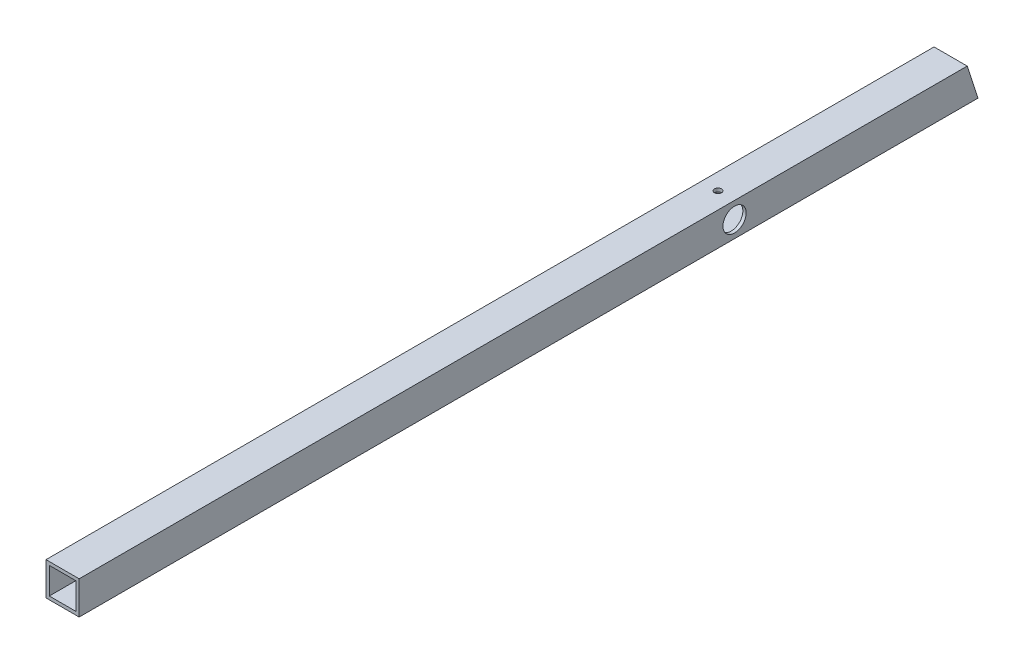
ISO-10303-21;
HEADER;
FILE_DESCRIPTION(('STEP AP214'),'2;1');
FILE_NAME('part.step','',(''),(''),'','','');
FILE_SCHEMA(('AUTOMOTIVE_DESIGN { 1 0 10303 214 1 1 1 1 }'));
ENDSEC;
DATA;
#1=APPLICATION_CONTEXT('core data for automotive mechanical design processes');
#2=APPLICATION_PROTOCOL_DEFINITION('international standard','automotive_design',2000,#1);
#3=PRODUCT_CONTEXT('',#1,'mechanical');
#4=PRODUCT('Part','Part','',(#3));
#5=PRODUCT_RELATED_PRODUCT_CATEGORY('part','',(#4));
#6=PRODUCT_DEFINITION_FORMATION('','',#4);
#7=PRODUCT_DEFINITION_CONTEXT('part definition',#1,'design');
#8=PRODUCT_DEFINITION('design','',#6,#7);
#9=PRODUCT_DEFINITION_SHAPE('','',#8);
#10=(LENGTH_UNIT() NAMED_UNIT(*) SI_UNIT(.MILLI.,.METRE.));
#11=(NAMED_UNIT(*) PLANE_ANGLE_UNIT() SI_UNIT($,.RADIAN.));
#12=(NAMED_UNIT(*) SI_UNIT($,.STERADIAN.) SOLID_ANGLE_UNIT());
#13=UNCERTAINTY_MEASURE_WITH_UNIT(LENGTH_MEASURE(1.E-05),#10,'distance_accuracy_value','');
#14=(GEOMETRIC_REPRESENTATION_CONTEXT(3) GLOBAL_UNCERTAINTY_ASSIGNED_CONTEXT((#13)) GLOBAL_UNIT_ASSIGNED_CONTEXT((#10,
#11,#12)) REPRESENTATION_CONTEXT('',''));
#15=CARTESIAN_POINT('',(0.,0.,0.));
#16=DIRECTION('',(0.,0.,1.));
#17=DIRECTION('',(1.,0.,0.));
#18=AXIS2_PLACEMENT_3D('',#15,#16,#17);
#19=CARTESIAN_POINT('',(15.875,31.75,233.045));
#20=DIRECTION('',(0.,1.,0.));
#21=DIRECTION('',(0.,0.,1.));
#22=AXIS2_PLACEMENT_3D('',#19,#20,#21);
#23=CYLINDRICAL_SURFACE('',#22,3.3655);
#24=CARTESIAN_POINT('',(15.875,28.575,233.045));
#25=DIRECTION('',(0.,1.,0.));
#26=DIRECTION('',(0.,0.,1.));
#27=AXIS2_PLACEMENT_3D('',#24,#25,#26);
#28=CIRCLE('',#27,3.3655);
#29=CARTESIAN_POINT('',(15.875,28.575,236.4105));
#30=VERTEX_POINT('',#29);
#31=EDGE_CURVE('E88',#30,#30,#28,.F.);
#32=ORIENTED_EDGE('',*,*,#31,.T.);
#33=EDGE_LOOP('',(#32));
#34=FACE_BOUND('',#33,.T.);
#35=CARTESIAN_POINT('',(15.875,31.75,233.045));
#36=DIRECTION('',(0.,1.,0.));
#37=DIRECTION('',(0.,0.,1.));
#38=AXIS2_PLACEMENT_3D('',#35,#36,#37);
#39=CIRCLE('',#38,3.3655);
#40=CARTESIAN_POINT('',(15.875,31.75,236.4105));
#41=VERTEX_POINT('',#40);
#42=EDGE_CURVE('E20',#41,#41,#39,.F.);
#43=ORIENTED_EDGE('',*,*,#42,.F.);
#44=EDGE_LOOP('',(#43));
#45=FACE_BOUND('',#44,.T.);
#46=ADVANCED_FACE('F17',(#34,#45),#23,.F.);
#47=CARTESIAN_POINT('',(31.75,15.875,233.045));
#48=DIRECTION('',(1.,0.,0.));
#49=DIRECTION('',(0.,0.,-1.));
#50=AXIS2_PLACEMENT_3D('',#47,#48,#49);
#51=CYLINDRICAL_SURFACE('',#50,11.1125);
#52=CARTESIAN_POINT('',(28.575,15.875,233.045));
#53=DIRECTION('',(1.,0.,0.));
#54=DIRECTION('',(0.,0.,-1.));
#55=AXIS2_PLACEMENT_3D('',#52,#53,#54);
#56=CIRCLE('',#55,11.1125);
#57=CARTESIAN_POINT('',(28.575,15.875,221.9325));
#58=VERTEX_POINT('',#57);
#59=EDGE_CURVE('E122',#58,#58,#56,.F.);
#60=ORIENTED_EDGE('',*,*,#59,.T.);
#61=EDGE_LOOP('',(#60));
#62=FACE_BOUND('',#61,.T.);
#63=CARTESIAN_POINT('',(31.75,15.875,233.045));
#64=DIRECTION('',(1.,0.,0.));
#65=DIRECTION('',(0.,0.,-1.));
#66=AXIS2_PLACEMENT_3D('',#63,#64,#65);
#67=CIRCLE('',#66,11.1125);
#68=CARTESIAN_POINT('',(31.75,15.875,221.9325));
#69=VERTEX_POINT('',#68);
#70=EDGE_CURVE('E114',#69,#69,#67,.F.);
#71=ORIENTED_EDGE('',*,*,#70,.F.);
#72=EDGE_LOOP('',(#71));
#73=FACE_BOUND('',#72,.T.);
#74=ADVANCED_FACE('F148',(#62,#73),#51,.F.);
#75=CARTESIAN_POINT('',(31.75,15.875,233.045));
#76=DIRECTION('',(1.,0.,0.));
#77=DIRECTION('',(0.,0.,-1.));
#78=AXIS2_PLACEMENT_3D('',#75,#76,#77);
#79=CYLINDRICAL_SURFACE('',#78,11.1125);
#80=CARTESIAN_POINT('',(3.175,15.875,233.045));
#81=DIRECTION('',(1.,0.,0.));
#82=DIRECTION('',(0.,0.,-1.));
#83=AXIS2_PLACEMENT_3D('',#80,#81,#82);
#84=CIRCLE('',#83,11.1125);
#85=CARTESIAN_POINT('',(3.175,15.875,221.9325));
#86=VERTEX_POINT('',#85);
#87=EDGE_CURVE('E89',#86,#86,#84,.T.);
#88=ORIENTED_EDGE('',*,*,#87,.T.);
#89=EDGE_LOOP('',(#88));
#90=FACE_BOUND('',#89,.T.);
#91=CARTESIAN_POINT('',(0.,15.875,233.045));
#92=DIRECTION('',(1.,0.,0.));
#93=DIRECTION('',(0.,0.,-1.));
#94=AXIS2_PLACEMENT_3D('',#91,#92,#93);
#95=CIRCLE('',#94,11.1125);
#96=CARTESIAN_POINT('',(0.,15.875,221.9325));
#97=VERTEX_POINT('',#96);
#98=EDGE_CURVE('E129',#97,#97,#95,.T.);
#99=ORIENTED_EDGE('',*,*,#98,.F.);
#100=EDGE_LOOP('',(#99));
#101=FACE_BOUND('',#100,.T.);
#102=ADVANCED_FACE('F154',(#90,#101),#79,.F.);
#103=CARTESIAN_POINT('',(31.75,31.75,0.));
#104=DIRECTION('',(0.,1.,0.));
#105=DIRECTION('',(0.,0.,1.));
#106=AXIS2_PLACEMENT_3D('',#103,#104,#105);
#107=PLANE('',#106);
#108=ORIENTED_EDGE('',*,*,#42,.T.);
#109=EDGE_LOOP('',(#108));
#110=FACE_BOUND('',#109,.T.);
#111=DIRECTION('',(0.,0.,-1.));
#112=VECTOR('',#111,1.);
#113=CARTESIAN_POINT('',(31.75,31.75,0.));
#114=LINE('',#113,#112);
#115=CARTESIAN_POINT('',(31.75,31.75,10.3162003553939));
#116=VERTEX_POINT('',#115);
#117=CARTESIAN_POINT('',(31.75,31.75,860.425));
#118=VERTEX_POINT('',#117);
#119=EDGE_CURVE('E115',#116,#118,#114,.F.);
#120=ORIENTED_EDGE('',*,*,#119,.F.);
#121=DIRECTION('',(1.,0.,0.));
#122=VECTOR('',#121,1.);
#123=CARTESIAN_POINT('',(31.75,31.75,10.3162003553939));
#124=LINE('',#123,#122);
#125=CARTESIAN_POINT('',(0.,31.75,10.3162003553939));
#126=VERTEX_POINT('',#125);
#127=EDGE_CURVE('E210',#116,#126,#124,.F.);
#128=ORIENTED_EDGE('',*,*,#127,.T.);
#129=DIRECTION('',(0.,0.,1.));
#130=VECTOR('',#129,1.);
#131=CARTESIAN_POINT('',(0.,31.75,0.));
#132=LINE('',#131,#130);
#133=CARTESIAN_POINT('',(0.,31.75,860.425));
#134=VERTEX_POINT('',#133);
#135=EDGE_CURVE('E132',#134,#126,#132,.F.);
#136=ORIENTED_EDGE('',*,*,#135,.F.);
#137=DIRECTION('',(1.,0.,0.));
#138=VECTOR('',#137,1.);
#139=CARTESIAN_POINT('',(0.,31.75,860.425));
#140=LINE('',#139,#138);
#141=EDGE_CURVE('E106',#118,#134,#140,.F.);
#142=ORIENTED_EDGE('',*,*,#141,.F.);
#143=EDGE_LOOP('',(#120,#128,#136,#142));
#144=FACE_BOUND('',#143,.T.);
#145=ADVANCED_FACE('F144',(#110,#144),#107,.T.);
#146=CARTESIAN_POINT('',(3.175,31.75,0.));
#147=DIRECTION('',(-1.,0.,0.));
#148=DIRECTION('',(0.,0.,1.));
#149=AXIS2_PLACEMENT_3D('',#146,#147,#148);
#150=PLANE('',#149);
#151=ORIENTED_EDGE('',*,*,#87,.F.);
#152=EDGE_LOOP('',(#151));
#153=FACE_BOUND('',#152,.T.);
#154=DIRECTION('',(0.,1.,0.));
#155=VECTOR('',#154,1.);
#156=CARTESIAN_POINT('',(3.175,0.,860.425));
#157=LINE('',#156,#155);
#158=CARTESIAN_POINT('',(3.175,3.175,860.425));
#159=VERTEX_POINT('',#158);
#160=CARTESIAN_POINT('',(3.175,28.575,860.425));
#161=VERTEX_POINT('',#160);
#162=EDGE_CURVE('E82',#159,#161,#157,.T.);
#163=ORIENTED_EDGE('',*,*,#162,.F.);
#164=DIRECTION('',(0.,0.,-1.));
#165=VECTOR('',#164,1.);
#166=CARTESIAN_POINT('',(3.175,3.175,0.));
#167=LINE('',#166,#165);
#168=CARTESIAN_POINT('',(3.175,3.17499999999994,1.03162003554023));
#169=VERTEX_POINT('',#168);
#170=EDGE_CURVE('E118',#159,#169,#167,.T.);
#171=ORIENTED_EDGE('',*,*,#170,.T.);
#172=DIRECTION('',(0.,-0.951056516295172,-0.309016994374891));
#173=VECTOR('',#172,1.);
#174=CARTESIAN_POINT('',(3.175,31.75,10.3162003553939));
#175=LINE('',#174,#173);
#176=CARTESIAN_POINT('',(3.175,28.575,9.28458031985477));
#177=VERTEX_POINT('',#176);
#178=EDGE_CURVE('E85',#169,#177,#175,.F.);
#179=ORIENTED_EDGE('',*,*,#178,.T.);
#180=DIRECTION('',(0.,0.,1.));
#181=VECTOR('',#180,1.);
#182=CARTESIAN_POINT('',(3.175,28.575,0.));
#183=LINE('',#182,#181);
#184=EDGE_CURVE('E78',#177,#161,#183,.T.);
#185=ORIENTED_EDGE('',*,*,#184,.T.);
#186=EDGE_LOOP('',(#163,#171,#179,#185));
#187=FACE_BOUND('',#186,.T.);
#188=ADVANCED_FACE('F80',(#153,#187),#150,.F.);
#189=CARTESIAN_POINT('',(31.75,28.575,0.));
#190=DIRECTION('',(0.,1.,0.));
#191=DIRECTION('',(0.,0.,1.));
#192=AXIS2_PLACEMENT_3D('',#189,#190,#191);
#193=PLANE('',#192);
#194=ORIENTED_EDGE('',*,*,#31,.F.);
#195=EDGE_LOOP('',(#194));
#196=FACE_BOUND('',#195,.T.);
#197=DIRECTION('',(1.,0.,0.));
#198=VECTOR('',#197,1.);
#199=CARTESIAN_POINT('',(0.,28.575,860.425));
#200=LINE('',#199,#198);
#201=CARTESIAN_POINT('',(28.575,28.575,860.425));
#202=VERTEX_POINT('',#201);
#203=EDGE_CURVE('E92',#161,#202,#200,.T.);
#204=ORIENTED_EDGE('',*,*,#203,.F.);
#205=ORIENTED_EDGE('',*,*,#184,.F.);
#206=DIRECTION('',(1.,0.,0.));
#207=VECTOR('',#206,1.);
#208=CARTESIAN_POINT('',(31.75,28.575,9.28458031985468));
#209=LINE('',#208,#207);
#210=CARTESIAN_POINT('',(28.575,28.575,9.28458031985477));
#211=VERTEX_POINT('',#210);
#212=EDGE_CURVE('E230',#177,#211,#209,.T.);
#213=ORIENTED_EDGE('',*,*,#212,.T.);
#214=DIRECTION('',(0.,0.,-1.));
#215=VECTOR('',#214,1.);
#216=CARTESIAN_POINT('',(28.575,28.575,0.));
#217=LINE('',#216,#215);
#218=EDGE_CURVE('E95',#211,#202,#217,.F.);
#219=ORIENTED_EDGE('',*,*,#218,.T.);
#220=EDGE_LOOP('',(#204,#205,#213,#219));
#221=FACE_BOUND('',#220,.T.);
#222=ADVANCED_FACE('F93',(#196,#221),#193,.F.);
#223=CARTESIAN_POINT('',(28.575,0.,0.));
#224=DIRECTION('',(1.,0.,0.));
#225=DIRECTION('',(0.,0.,-1.));
#226=AXIS2_PLACEMENT_3D('',#223,#224,#225);
#227=PLANE('',#226);
#228=ORIENTED_EDGE('',*,*,#59,.F.);
#229=EDGE_LOOP('',(#228));
#230=FACE_BOUND('',#229,.T.);
#231=DIRECTION('',(0.,1.,0.));
#232=VECTOR('',#231,1.);
#233=CARTESIAN_POINT('',(28.575,0.,860.425));
#234=LINE('',#233,#232);
#235=CARTESIAN_POINT('',(28.575,3.175,860.425));
#236=VERTEX_POINT('',#235);
#237=EDGE_CURVE('E99',#202,#236,#234,.F.);
#238=ORIENTED_EDGE('',*,*,#237,.F.);
#239=ORIENTED_EDGE('',*,*,#218,.F.);
#240=DIRECTION('',(0.,-0.951056516295172,-0.309016994374891));
#241=VECTOR('',#240,1.);
#242=CARTESIAN_POINT('',(28.575,31.75,10.3162003553939));
#243=LINE('',#242,#241);
#244=CARTESIAN_POINT('',(28.575,3.17499999999994,1.0316200355401));
#245=VERTEX_POINT('',#244);
#246=EDGE_CURVE('E128',#211,#245,#243,.T.);
#247=ORIENTED_EDGE('',*,*,#246,.T.);
#248=DIRECTION('',(0.,0.,-1.));
#249=VECTOR('',#248,1.);
#250=CARTESIAN_POINT('',(28.575,3.175,0.));
#251=LINE('',#250,#249);
#252=EDGE_CURVE('E120',#245,#236,#251,.F.);
#253=ORIENTED_EDGE('',*,*,#252,.T.);
#254=EDGE_LOOP('',(#238,#239,#247,#253));
#255=FACE_BOUND('',#254,.T.);
#256=ADVANCED_FACE('F185',(#230,#255),#227,.F.);
#257=CARTESIAN_POINT('',(0.,3.175,0.));
#258=DIRECTION('',(0.,-1.,0.));
#259=DIRECTION('',(0.,0.,-1.));
#260=AXIS2_PLACEMENT_3D('',#257,#258,#259);
#261=PLANE('',#260);
#262=CARTESIAN_POINT('',(15.875,3.175,233.045));
#263=DIRECTION('',(0.,1.,0.));
#264=DIRECTION('',(0.,0.,1.));
#265=AXIS2_PLACEMENT_3D('',#262,#263,#264);
#266=CIRCLE('',#265,3.3655);
#267=CARTESIAN_POINT('',(15.875,3.175,236.4105));
#268=VERTEX_POINT('',#267);
#269=EDGE_CURVE('E124',#268,#268,#266,.F.);
#270=ORIENTED_EDGE('',*,*,#269,.T.);
#271=EDGE_LOOP('',(#270));
#272=FACE_BOUND('',#271,.T.);
#273=DIRECTION('',(1.,0.,0.));
#274=VECTOR('',#273,1.);
#275=CARTESIAN_POINT('',(0.,3.175,860.425));
#276=LINE('',#275,#274);
#277=EDGE_CURVE('E105',#236,#159,#276,.F.);
#278=ORIENTED_EDGE('',*,*,#277,.F.);
#279=ORIENTED_EDGE('',*,*,#252,.F.);
#280=DIRECTION('',(1.,0.,0.));
#281=VECTOR('',#280,1.);
#282=CARTESIAN_POINT('',(31.75,3.17499999999974,1.03162003554044));
#283=LINE('',#282,#281);
#284=EDGE_CURVE('E214',#245,#169,#283,.F.);
#285=ORIENTED_EDGE('',*,*,#284,.T.);
#286=ORIENTED_EDGE('',*,*,#170,.F.);
#287=EDGE_LOOP('',(#278,#279,#285,#286));
#288=FACE_BOUND('',#287,.T.);
#289=ADVANCED_FACE('F181',(#272,#288),#261,.F.);
#290=CARTESIAN_POINT('',(31.75,0.,0.));
#291=DIRECTION('',(1.,0.,0.));
#292=DIRECTION('',(0.,0.,-1.));
#293=AXIS2_PLACEMENT_3D('',#290,#291,#292);
#294=PLANE('',#293);
#295=ORIENTED_EDGE('',*,*,#70,.T.);
#296=EDGE_LOOP('',(#295));
#297=FACE_BOUND('',#296,.T.);
#298=DIRECTION('',(0.,0.,-1.));
#299=VECTOR('',#298,1.);
#300=CARTESIAN_POINT('',(31.75,0.,0.));
#301=LINE('',#300,#299);
#302=CARTESIAN_POINT('',(31.75,0.,8.97466958146176E-13));
#303=VERTEX_POINT('',#302);
#304=CARTESIAN_POINT('',(31.75,0.,860.425));
#305=VERTEX_POINT('',#304);
#306=EDGE_CURVE('E127',#303,#305,#301,.F.);
#307=ORIENTED_EDGE('',*,*,#306,.F.);
#308=DIRECTION('',(0.,-0.951056516295172,-0.309016994374891));
#309=VECTOR('',#308,1.);
#310=CARTESIAN_POINT('',(31.75,31.75,10.3162003553939));
#311=LINE('',#310,#309);
#312=EDGE_CURVE('E215',#303,#116,#311,.F.);
#313=ORIENTED_EDGE('',*,*,#312,.T.);
#314=ORIENTED_EDGE('',*,*,#119,.T.);
#315=DIRECTION('',(0.,1.,0.));
#316=VECTOR('',#315,1.);
#317=CARTESIAN_POINT('',(31.75,0.,860.425));
#318=LINE('',#317,#316);
#319=EDGE_CURVE('E108',#305,#118,#318,.T.);
#320=ORIENTED_EDGE('',*,*,#319,.F.);
#321=EDGE_LOOP('',(#307,#313,#314,#320));
#322=FACE_BOUND('',#321,.T.);
#323=ADVANCED_FACE('F178',(#297,#322),#294,.T.);
#324=CARTESIAN_POINT('',(0.,0.,860.425));
#325=DIRECTION('',(0.,0.,1.));
#326=DIRECTION('',(1.,0.,0.));
#327=AXIS2_PLACEMENT_3D('',#324,#325,#326);
#328=PLANE('',#327);
#329=ORIENTED_EDGE('',*,*,#237,.T.);
#330=ORIENTED_EDGE('',*,*,#277,.T.);
#331=ORIENTED_EDGE('',*,*,#162,.T.);
#332=ORIENTED_EDGE('',*,*,#203,.T.);
#333=EDGE_LOOP('',(#329,#330,#331,#332));
#334=FACE_BOUND('',#333,.T.);
#335=DIRECTION('',(0.,1.,0.));
#336=VECTOR('',#335,1.);
#337=CARTESIAN_POINT('',(0.,31.75,860.425));
#338=LINE('',#337,#336);
#339=CARTESIAN_POINT('',(0.,0.,860.425));
#340=VERTEX_POINT('',#339);
#341=EDGE_CURVE('E206',#340,#134,#338,.T.);
#342=ORIENTED_EDGE('',*,*,#341,.F.);
#343=DIRECTION('',(1.,0.,0.));
#344=VECTOR('',#343,1.);
#345=CARTESIAN_POINT('',(0.,0.,860.425));
#346=LINE('',#345,#344);
#347=EDGE_CURVE('E237',#305,#340,#346,.F.);
#348=ORIENTED_EDGE('',*,*,#347,.F.);
#349=ORIENTED_EDGE('',*,*,#319,.T.);
#350=ORIENTED_EDGE('',*,*,#141,.T.);
#351=EDGE_LOOP('',(#342,#348,#349,#350));
#352=FACE_BOUND('',#351,.T.);
#353=ADVANCED_FACE('F102',(#334,#352),#328,.T.);
#354=CARTESIAN_POINT('',(0.,31.75,0.));
#355=DIRECTION('',(-1.,0.,0.));
#356=DIRECTION('',(0.,0.,1.));
#357=AXIS2_PLACEMENT_3D('',#354,#355,#356);
#358=PLANE('',#357);
#359=ORIENTED_EDGE('',*,*,#98,.T.);
#360=EDGE_LOOP('',(#359));
#361=FACE_BOUND('',#360,.T.);
#362=ORIENTED_EDGE('',*,*,#135,.T.);
#363=DIRECTION('',(0.,-0.951056516295172,-0.309016994374891));
#364=VECTOR('',#363,1.);
#365=CARTESIAN_POINT('',(0.,31.75,10.3162003553939));
#366=LINE('',#365,#364);
#367=CARTESIAN_POINT('',(0.,0.,9.00247685353669E-13));
#368=VERTEX_POINT('',#367);
#369=EDGE_CURVE('E35',#126,#368,#366,.T.);
#370=ORIENTED_EDGE('',*,*,#369,.T.);
#371=DIRECTION('',(0.,0.,-1.));
#372=VECTOR('',#371,1.);
#373=CARTESIAN_POINT('',(0.,0.,0.));
#374=LINE('',#373,#372);
#375=EDGE_CURVE('E240',#340,#368,#374,.T.);
#376=ORIENTED_EDGE('',*,*,#375,.F.);
#377=ORIENTED_EDGE('',*,*,#341,.T.);
#378=EDGE_LOOP('',(#362,#370,#376,#377));
#379=FACE_BOUND('',#378,.T.);
#380=ADVANCED_FACE('F171',(#361,#379),#358,.T.);
#381=CARTESIAN_POINT('',(31.75,31.75,10.3162003553939));
#382=DIRECTION('',(0.,-0.309016994374891,0.951056516295172));
#383=DIRECTION('',(0.,-0.951056516295172,-0.309016994374891));
#384=AXIS2_PLACEMENT_3D('',#381,#382,#383);
#385=PLANE('',#384);
#386=ORIENTED_EDGE('',*,*,#212,.F.);
#387=ORIENTED_EDGE('',*,*,#178,.F.);
#388=ORIENTED_EDGE('',*,*,#284,.F.);
#389=ORIENTED_EDGE('',*,*,#246,.F.);
#390=EDGE_LOOP('',(#386,#387,#388,#389));
#391=FACE_BOUND('',#390,.T.);
#392=ORIENTED_EDGE('',*,*,#312,.F.);
#393=DIRECTION('',(1.,0.,0.));
#394=VECTOR('',#393,1.);
#395=CARTESIAN_POINT('',(0.,0.,7.94166764434948E-13));
#396=LINE('',#395,#394);
#397=EDGE_CURVE('E26',#368,#303,#396,.T.);
#398=ORIENTED_EDGE('',*,*,#397,.F.);
#399=ORIENTED_EDGE('',*,*,#369,.F.);
#400=ORIENTED_EDGE('',*,*,#127,.F.);
#401=EDGE_LOOP('',(#392,#398,#399,#400));
#402=FACE_BOUND('',#401,.T.);
#403=ADVANCED_FACE('F164',(#391,#402),#385,.F.);
#404=CARTESIAN_POINT('',(15.875,31.75,233.045));
#405=DIRECTION('',(0.,1.,0.));
#406=DIRECTION('',(0.,0.,1.));
#407=AXIS2_PLACEMENT_3D('',#404,#405,#406);
#408=CYLINDRICAL_SURFACE('',#407,3.3655);
#409=ORIENTED_EDGE('',*,*,#269,.F.);
#410=EDGE_LOOP('',(#409));
#411=FACE_BOUND('',#410,.T.);
#412=CARTESIAN_POINT('',(15.875,0.,233.045));
#413=DIRECTION('',(0.,1.,0.));
#414=DIRECTION('',(0.,0.,1.));
#415=AXIS2_PLACEMENT_3D('',#412,#413,#414);
#416=CIRCLE('',#415,3.3655);
#417=CARTESIAN_POINT('',(15.875,0.,236.4105));
#418=VERTEX_POINT('',#417);
#419=EDGE_CURVE('E11',#418,#418,#416,.T.);
#420=ORIENTED_EDGE('',*,*,#419,.F.);
#421=EDGE_LOOP('',(#420));
#422=FACE_BOUND('',#421,.T.);
#423=ADVANCED_FACE('F158',(#411,#422),#408,.F.);
#424=CARTESIAN_POINT('',(0.,0.,0.));
#425=DIRECTION('',(0.,-1.,0.));
#426=DIRECTION('',(0.,0.,-1.));
#427=AXIS2_PLACEMENT_3D('',#424,#425,#426);
#428=PLANE('',#427);
#429=ORIENTED_EDGE('',*,*,#419,.T.);
#430=EDGE_LOOP('',(#429));
#431=FACE_BOUND('',#430,.T.);
#432=ORIENTED_EDGE('',*,*,#375,.T.);
#433=ORIENTED_EDGE('',*,*,#397,.T.);
#434=ORIENTED_EDGE('',*,*,#306,.T.);
#435=ORIENTED_EDGE('',*,*,#347,.T.);
#436=EDGE_LOOP('',(#432,#433,#434,#435));
#437=FACE_BOUND('',#436,.T.);
#438=ADVANCED_FACE('F156',(#431,#437),#428,.T.);
#439=CLOSED_SHELL('',(#46,#74,#102,#145,#188,#222,#256,#289,#323,#353,#380,#403,#423,#438));
#440=MANIFOLD_SOLID_BREP('B1',#439);
#441=ADVANCED_BREP_SHAPE_REPRESENTATION('',(#18,#440),#14);
#442=SHAPE_DEFINITION_REPRESENTATION(#9,#441);
ENDSEC;
END-ISO-10303-21;
